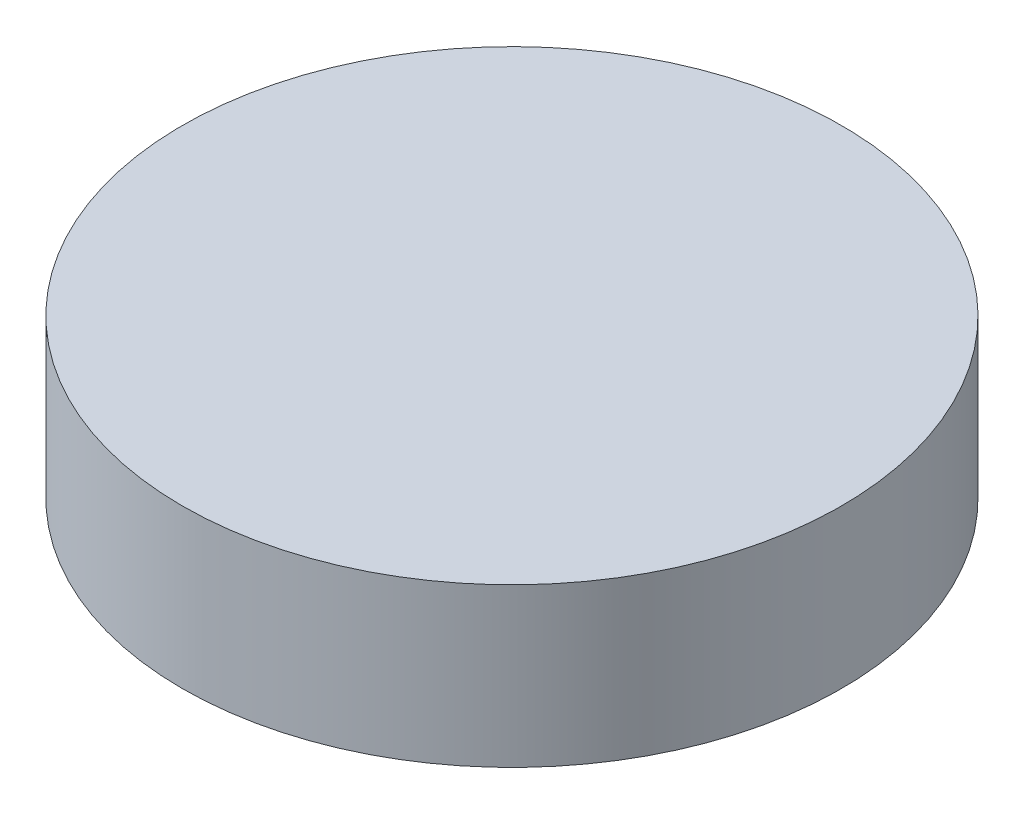
ISO-10303-21;
HEADER;
FILE_DESCRIPTION(('STEP AP214'),'2;1');
FILE_NAME('part.step','',(''),(''),'','','');
FILE_SCHEMA(('AUTOMOTIVE_DESIGN { 1 0 10303 214 1 1 1 1 }'));
ENDSEC;
DATA;
#1=APPLICATION_CONTEXT('core data for automotive mechanical design processes');
#2=APPLICATION_PROTOCOL_DEFINITION('international standard','automotive_design',2000,#1);
#3=PRODUCT_CONTEXT('',#1,'mechanical');
#4=PRODUCT('Part','Part','',(#3));
#5=PRODUCT_RELATED_PRODUCT_CATEGORY('part','',(#4));
#6=PRODUCT_DEFINITION_FORMATION('','',#4);
#7=PRODUCT_DEFINITION_CONTEXT('part definition',#1,'design');
#8=PRODUCT_DEFINITION('design','',#6,#7);
#9=PRODUCT_DEFINITION_SHAPE('','',#8);
#10=(LENGTH_UNIT() NAMED_UNIT(*) SI_UNIT(.MILLI.,.METRE.));
#11=(NAMED_UNIT(*) PLANE_ANGLE_UNIT() SI_UNIT($,.RADIAN.));
#12=(NAMED_UNIT(*) SI_UNIT($,.STERADIAN.) SOLID_ANGLE_UNIT());
#13=UNCERTAINTY_MEASURE_WITH_UNIT(LENGTH_MEASURE(1.E-05),#10,'distance_accuracy_value','');
#14=(GEOMETRIC_REPRESENTATION_CONTEXT(3) GLOBAL_UNCERTAINTY_ASSIGNED_CONTEXT((#13)) GLOBAL_UNIT_ASSIGNED_CONTEXT((#10,
#11,#12)) REPRESENTATION_CONTEXT('',''));
#15=CARTESIAN_POINT('',(0.,0.,0.));
#16=DIRECTION('',(0.,0.,1.));
#17=DIRECTION('',(1.,0.,0.));
#18=AXIS2_PLACEMENT_3D('',#15,#16,#17);
#19=CARTESIAN_POINT('',(50.,12.,-50.));
#20=DIRECTION('',(0.,-1.,0.));
#21=DIRECTION('',(0.,0.,-1.));
#22=AXIS2_PLACEMENT_3D('',#19,#20,#21);
#23=CYLINDRICAL_SURFACE('',#22,25.);
#24=CARTESIAN_POINT('',(50.,12.,-50.));
#25=DIRECTION('',(0.,1.,0.));
#26=DIRECTION('',(0.,0.,1.));
#27=AXIS2_PLACEMENT_3D('',#24,#25,#26);
#28=CIRCLE('',#27,25.);
#29=CARTESIAN_POINT('',(50.,12.,-25.));
#30=VERTEX_POINT('',#29);
#31=EDGE_CURVE('E10',#30,#30,#28,.T.);
#32=ORIENTED_EDGE('',*,*,#31,.F.);
#33=EDGE_LOOP('',(#32));
#34=FACE_BOUND('',#33,.T.);
#35=CARTESIAN_POINT('',(50.,0.,-50.));
#36=DIRECTION('',(0.,1.,0.));
#37=DIRECTION('',(0.,0.,1.));
#38=AXIS2_PLACEMENT_3D('',#35,#36,#37);
#39=CIRCLE('',#38,25.);
#40=CARTESIAN_POINT('',(50.,0.,-25.));
#41=VERTEX_POINT('',#40);
#42=EDGE_CURVE('E40',#41,#41,#39,.T.);
#43=ORIENTED_EDGE('',*,*,#42,.T.);
#44=EDGE_LOOP('',(#43));
#45=FACE_BOUND('',#44,.T.);
#46=ADVANCED_FACE('F37',(#34,#45),#23,.T.);
#47=CARTESIAN_POINT('',(50.,12.,-50.));
#48=DIRECTION('',(0.,1.,0.));
#49=DIRECTION('',(0.,0.,1.));
#50=AXIS2_PLACEMENT_3D('',#47,#48,#49);
#51=PLANE('',#50);
#52=ORIENTED_EDGE('',*,*,#31,.T.);
#53=EDGE_LOOP('',(#52));
#54=FACE_BOUND('',#53,.T.);
#55=ADVANCED_FACE('F52',(#54),#51,.T.);
#56=CARTESIAN_POINT('',(50.,0.,-50.));
#57=DIRECTION('',(0.,1.,0.));
#58=DIRECTION('',(0.,0.,1.));
#59=AXIS2_PLACEMENT_3D('',#56,#57,#58);
#60=PLANE('',#59);
#61=ORIENTED_EDGE('',*,*,#42,.F.);
#62=EDGE_LOOP('',(#61));
#63=FACE_BOUND('',#62,.T.);
#64=ADVANCED_FACE('F50',(#63),#60,.F.);
#65=CLOSED_SHELL('',(#46,#55,#64));
#66=MANIFOLD_SOLID_BREP('B2',#65);
#67=ADVANCED_BREP_SHAPE_REPRESENTATION('',(#18,#66),#14);
#68=SHAPE_DEFINITION_REPRESENTATION(#9,#67);
ENDSEC;
END-ISO-10303-21;
